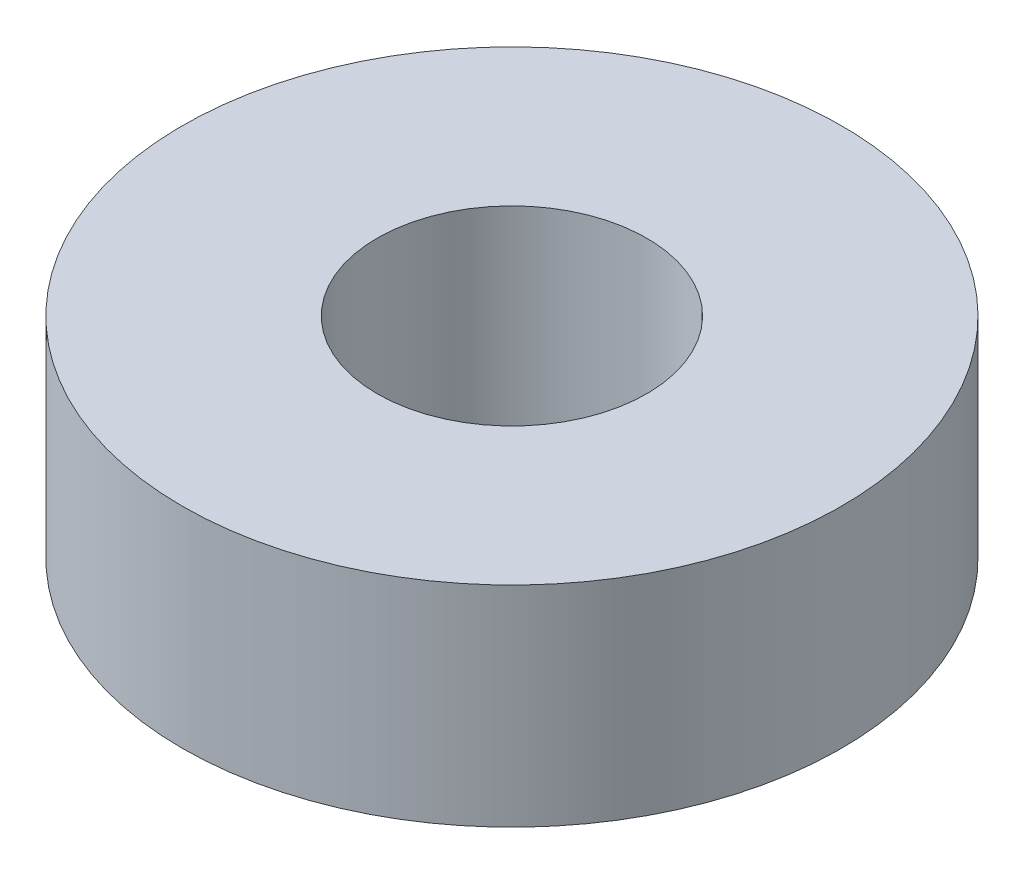
ISO-10303-21;
HEADER;
FILE_DESCRIPTION(('STEP AP214'),'2;1');
FILE_NAME('part.step','',(''),(''),'','','');
FILE_SCHEMA(('AUTOMOTIVE_DESIGN { 1 0 10303 214 1 1 1 1 }'));
ENDSEC;
DATA;
#1=APPLICATION_CONTEXT('core data for automotive mechanical design processes');
#2=APPLICATION_PROTOCOL_DEFINITION('international standard','automotive_design',2000,#1);
#3=PRODUCT_CONTEXT('',#1,'mechanical');
#4=PRODUCT('Part','Part','',(#3));
#5=PRODUCT_RELATED_PRODUCT_CATEGORY('part','',(#4));
#6=PRODUCT_DEFINITION_FORMATION('','',#4);
#7=PRODUCT_DEFINITION_CONTEXT('part definition',#1,'design');
#8=PRODUCT_DEFINITION('design','',#6,#7);
#9=PRODUCT_DEFINITION_SHAPE('','',#8);
#10=(LENGTH_UNIT() NAMED_UNIT(*) SI_UNIT(.MILLI.,.METRE.));
#11=(NAMED_UNIT(*) PLANE_ANGLE_UNIT() SI_UNIT($,.RADIAN.));
#12=(NAMED_UNIT(*) SI_UNIT($,.STERADIAN.) SOLID_ANGLE_UNIT());
#13=UNCERTAINTY_MEASURE_WITH_UNIT(LENGTH_MEASURE(1.E-05),#10,'distance_accuracy_value','');
#14=(GEOMETRIC_REPRESENTATION_CONTEXT(3) GLOBAL_UNCERTAINTY_ASSIGNED_CONTEXT((#13)) GLOBAL_UNIT_ASSIGNED_CONTEXT((#10,
#11,#12)) REPRESENTATION_CONTEXT('',''));
#15=CARTESIAN_POINT('',(0.,0.,0.));
#16=DIRECTION('',(0.,0.,1.));
#17=DIRECTION('',(1.,0.,0.));
#18=AXIS2_PLACEMENT_3D('',#15,#16,#17);
#19=CARTESIAN_POINT('',(0.,7.,0.));
#20=DIRECTION('',(0.,1.,0.));
#21=DIRECTION('',(0.,0.,1.));
#22=AXIS2_PLACEMENT_3D('',#19,#20,#21);
#23=PLANE('',#22);
#24=CARTESIAN_POINT('',(0.,7.,0.));
#25=DIRECTION('',(0.,1.,0.));
#26=DIRECTION('',(0.,0.,1.));
#27=AXIS2_PLACEMENT_3D('',#24,#25,#26);
#28=CIRCLE('',#27,11.);
#29=CARTESIAN_POINT('',(0.,7.,11.));
#30=VERTEX_POINT('',#29);
#31=EDGE_CURVE('E10',#30,#30,#28,.T.);
#32=ORIENTED_EDGE('',*,*,#31,.T.);
#33=EDGE_LOOP('',(#32));
#34=FACE_BOUND('',#33,.T.);
#35=CARTESIAN_POINT('',(0.,7.,0.));
#36=DIRECTION('',(0.,1.,0.));
#37=DIRECTION('',(0.,0.,1.));
#38=AXIS2_PLACEMENT_3D('',#35,#36,#37);
#39=CIRCLE('',#38,4.5);
#40=CARTESIAN_POINT('',(0.,7.,4.5));
#41=VERTEX_POINT('',#40);
#42=EDGE_CURVE('E44',#41,#41,#39,.T.);
#43=ORIENTED_EDGE('',*,*,#42,.F.);
#44=EDGE_LOOP('',(#43));
#45=FACE_BOUND('',#44,.T.);
#46=ADVANCED_FACE('F33',(#34,#45),#23,.T.);
#47=CARTESIAN_POINT('',(0.,0.,0.));
#48=DIRECTION('',(0.,1.,0.));
#49=DIRECTION('',(0.,0.,1.));
#50=AXIS2_PLACEMENT_3D('',#47,#48,#49);
#51=PLANE('',#50);
#52=CARTESIAN_POINT('',(0.,0.,0.));
#53=DIRECTION('',(0.,1.,0.));
#54=DIRECTION('',(0.,0.,1.));
#55=AXIS2_PLACEMENT_3D('',#52,#53,#54);
#56=CIRCLE('',#55,11.);
#57=CARTESIAN_POINT('',(0.,0.,11.));
#58=VERTEX_POINT('',#57);
#59=EDGE_CURVE('E37',#58,#58,#56,.T.);
#60=ORIENTED_EDGE('',*,*,#59,.F.);
#61=EDGE_LOOP('',(#60));
#62=FACE_BOUND('',#61,.T.);
#63=CARTESIAN_POINT('',(0.,0.,0.));
#64=DIRECTION('',(0.,1.,0.));
#65=DIRECTION('',(0.,0.,1.));
#66=AXIS2_PLACEMENT_3D('',#63,#64,#65);
#67=CIRCLE('',#66,4.5);
#68=CARTESIAN_POINT('',(0.,0.,4.5));
#69=VERTEX_POINT('',#68);
#70=EDGE_CURVE('E46',#69,#69,#67,.T.);
#71=ORIENTED_EDGE('',*,*,#70,.T.);
#72=EDGE_LOOP('',(#71));
#73=FACE_BOUND('',#72,.T.);
#74=ADVANCED_FACE('F56',(#62,#73),#51,.F.);
#75=CARTESIAN_POINT('',(0.,7.,0.));
#76=DIRECTION('',(0.,-1.,0.));
#77=DIRECTION('',(0.,0.,-1.));
#78=AXIS2_PLACEMENT_3D('',#75,#76,#77);
#79=CYLINDRICAL_SURFACE('',#78,11.);
#80=ORIENTED_EDGE('',*,*,#31,.F.);
#81=EDGE_LOOP('',(#80));
#82=FACE_BOUND('',#81,.T.);
#83=ORIENTED_EDGE('',*,*,#59,.T.);
#84=EDGE_LOOP('',(#83));
#85=FACE_BOUND('',#84,.T.);
#86=ADVANCED_FACE('F35',(#82,#85),#79,.T.);
#87=CARTESIAN_POINT('',(0.,7.,0.));
#88=DIRECTION('',(0.,-1.,0.));
#89=DIRECTION('',(0.,0.,-1.));
#90=AXIS2_PLACEMENT_3D('',#87,#88,#89);
#91=CYLINDRICAL_SURFACE('',#90,4.5);
#92=ORIENTED_EDGE('',*,*,#42,.T.);
#93=EDGE_LOOP('',(#92));
#94=FACE_BOUND('',#93,.T.);
#95=ORIENTED_EDGE('',*,*,#70,.F.);
#96=EDGE_LOOP('',(#95));
#97=FACE_BOUND('',#96,.T.);
#98=ADVANCED_FACE('F52',(#94,#97),#91,.F.);
#99=CLOSED_SHELL('',(#46,#74,#86,#98));
#100=MANIFOLD_SOLID_BREP('B2',#99);
#101=ADVANCED_BREP_SHAPE_REPRESENTATION('',(#18,#100),#14);
#102=SHAPE_DEFINITION_REPRESENTATION(#9,#101);
ENDSEC;
END-ISO-10303-21;
